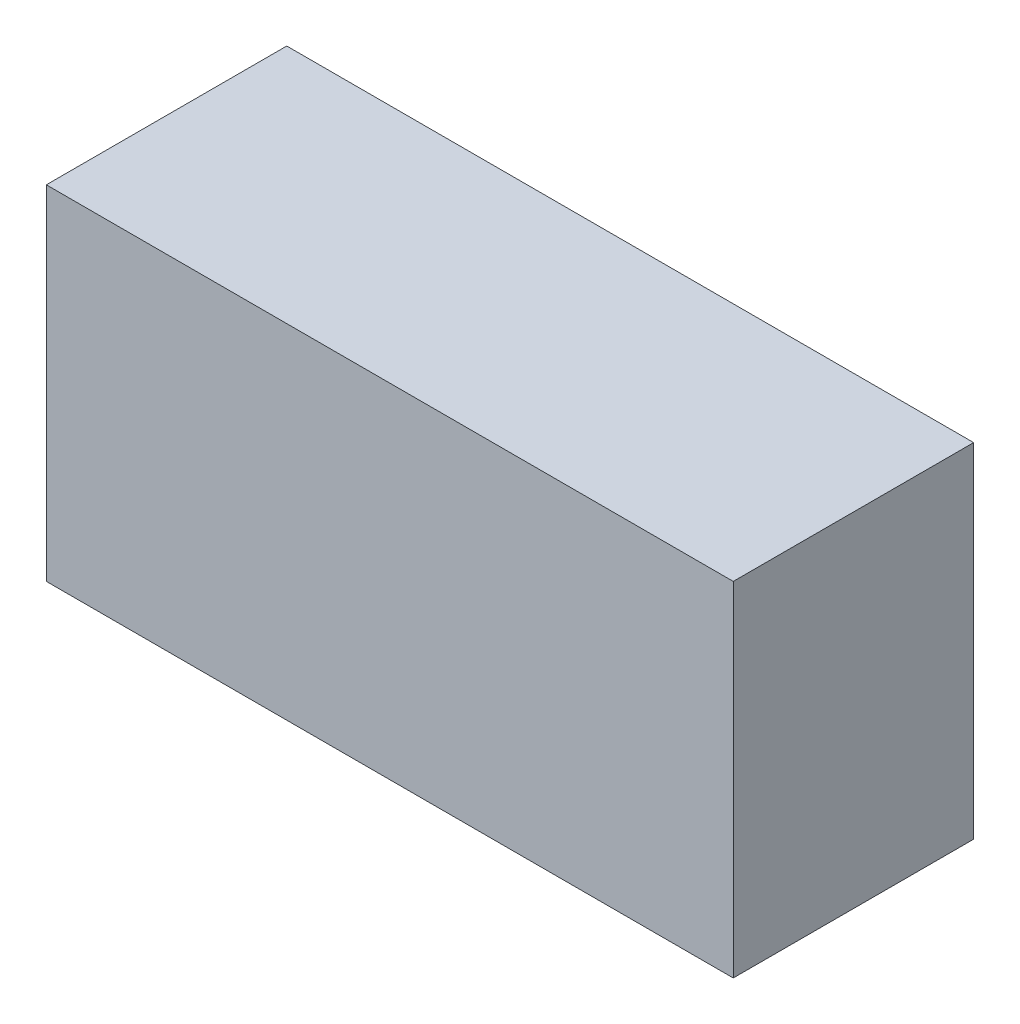
ISO-10303-21;
HEADER;
FILE_DESCRIPTION(('STEP AP214'),'2;1');
FILE_NAME('part.step','',(''),(''),'','','');
FILE_SCHEMA(('AUTOMOTIVE_DESIGN { 1 0 10303 214 1 1 1 1 }'));
ENDSEC;
DATA;
#1=APPLICATION_CONTEXT('core data for automotive mechanical design processes');
#2=APPLICATION_PROTOCOL_DEFINITION('international standard','automotive_design',2000,#1);
#3=PRODUCT_CONTEXT('',#1,'mechanical');
#4=PRODUCT('Part','Part','',(#3));
#5=PRODUCT_RELATED_PRODUCT_CATEGORY('part','',(#4));
#6=PRODUCT_DEFINITION_FORMATION('','',#4);
#7=PRODUCT_DEFINITION_CONTEXT('part definition',#1,'design');
#8=PRODUCT_DEFINITION('design','',#6,#7);
#9=PRODUCT_DEFINITION_SHAPE('','',#8);
#10=(LENGTH_UNIT() NAMED_UNIT(*) SI_UNIT(.MILLI.,.METRE.));
#11=(NAMED_UNIT(*) PLANE_ANGLE_UNIT() SI_UNIT($,.RADIAN.));
#12=(NAMED_UNIT(*) SI_UNIT($,.STERADIAN.) SOLID_ANGLE_UNIT());
#13=UNCERTAINTY_MEASURE_WITH_UNIT(LENGTH_MEASURE(1.E-05),#10,'distance_accuracy_value','');
#14=(GEOMETRIC_REPRESENTATION_CONTEXT(3) GLOBAL_UNCERTAINTY_ASSIGNED_CONTEXT((#13)) GLOBAL_UNIT_ASSIGNED_CONTEXT((#10,
#11,#12)) REPRESENTATION_CONTEXT('',''));
#15=CARTESIAN_POINT('',(0.,0.,0.));
#16=DIRECTION('',(0.,0.,1.));
#17=DIRECTION('',(1.,0.,0.));
#18=AXIS2_PLACEMENT_3D('',#15,#16,#17);
#19=CARTESIAN_POINT('',(100.,50.,70.));
#20=DIRECTION('',(-1.,0.,0.));
#21=DIRECTION('',(0.,0.,1.));
#22=AXIS2_PLACEMENT_3D('',#19,#20,#21);
#23=PLANE('',#22);
#24=DIRECTION('',(0.,1.,0.));
#25=VECTOR('',#24,1.);
#26=CARTESIAN_POINT('',(100.,50.,0.));
#27=LINE('',#26,#25);
#28=CARTESIAN_POINT('',(100.,-50.,0.));
#29=VERTEX_POINT('',#28);
#30=CARTESIAN_POINT('',(100.,50.,0.));
#31=VERTEX_POINT('',#30);
#32=EDGE_CURVE('E105',#29,#31,#27,.T.);
#33=ORIENTED_EDGE('',*,*,#32,.T.);
#34=DIRECTION('',(0.,0.,-1.));
#35=VECTOR('',#34,1.);
#36=CARTESIAN_POINT('',(100.,50.,70.));
#37=LINE('',#36,#35);
#38=CARTESIAN_POINT('',(100.,50.,70.));
#39=VERTEX_POINT('',#38);
#40=EDGE_CURVE('E42',#39,#31,#37,.T.);
#41=ORIENTED_EDGE('',*,*,#40,.F.);
#42=DIRECTION('',(0.,1.,0.));
#43=VECTOR('',#42,1.);
#44=CARTESIAN_POINT('',(100.,50.,70.));
#45=LINE('',#44,#43);
#46=CARTESIAN_POINT('',(100.,-50.,70.));
#47=VERTEX_POINT('',#46);
#48=EDGE_CURVE('E92',#47,#39,#45,.T.);
#49=ORIENTED_EDGE('',*,*,#48,.F.);
#50=DIRECTION('',(0.,0.,-1.));
#51=VECTOR('',#50,1.);
#52=CARTESIAN_POINT('',(100.,-50.,70.));
#53=LINE('',#52,#51);
#54=EDGE_CURVE('E101',#47,#29,#53,.T.);
#55=ORIENTED_EDGE('',*,*,#54,.T.);
#56=EDGE_LOOP('',(#33,#41,#49,#55));
#57=FACE_BOUND('',#56,.T.);
#58=ADVANCED_FACE('F39',(#57),#23,.F.);
#59=CARTESIAN_POINT('',(-100.,50.,70.));
#60=DIRECTION('',(0.,-1.,0.));
#61=DIRECTION('',(0.,0.,-1.));
#62=AXIS2_PLACEMENT_3D('',#59,#60,#61);
#63=PLANE('',#62);
#64=DIRECTION('',(-1.,0.,0.));
#65=VECTOR('',#64,1.);
#66=CARTESIAN_POINT('',(-100.,50.,0.));
#67=LINE('',#66,#65);
#68=CARTESIAN_POINT('',(-100.,50.,0.));
#69=VERTEX_POINT('',#68);
#70=EDGE_CURVE('E97',#31,#69,#67,.T.);
#71=ORIENTED_EDGE('',*,*,#70,.T.);
#72=DIRECTION('',(0.,0.,-1.));
#73=VECTOR('',#72,1.);
#74=CARTESIAN_POINT('',(-100.,50.,70.));
#75=LINE('',#74,#73);
#76=CARTESIAN_POINT('',(-100.,50.,70.));
#77=VERTEX_POINT('',#76);
#78=EDGE_CURVE('E95',#77,#69,#75,.T.);
#79=ORIENTED_EDGE('',*,*,#78,.F.);
#80=DIRECTION('',(-1.,0.,0.));
#81=VECTOR('',#80,1.);
#82=CARTESIAN_POINT('',(-100.,50.,70.));
#83=LINE('',#82,#81);
#84=EDGE_CURVE('E87',#39,#77,#83,.T.);
#85=ORIENTED_EDGE('',*,*,#84,.F.);
#86=ORIENTED_EDGE('',*,*,#40,.T.);
#87=EDGE_LOOP('',(#71,#79,#85,#86));
#88=FACE_BOUND('',#87,.T.);
#89=ADVANCED_FACE('F96',(#88),#63,.F.);
#90=CARTESIAN_POINT('',(-100.,50.,70.));
#91=DIRECTION('',(1.,0.,0.));
#92=DIRECTION('',(0.,0.,-1.));
#93=AXIS2_PLACEMENT_3D('',#90,#91,#92);
#94=PLANE('',#93);
#95=DIRECTION('',(0.,-1.,0.));
#96=VECTOR('',#95,1.);
#97=CARTESIAN_POINT('',(-100.,50.,0.));
#98=LINE('',#97,#96);
#99=CARTESIAN_POINT('',(-100.,-50.,0.));
#100=VERTEX_POINT('',#99);
#101=EDGE_CURVE('E73',#69,#100,#98,.T.);
#102=ORIENTED_EDGE('',*,*,#101,.T.);
#103=DIRECTION('',(0.,0.,-1.));
#104=VECTOR('',#103,1.);
#105=CARTESIAN_POINT('',(-100.,-50.,70.));
#106=LINE('',#105,#104);
#107=CARTESIAN_POINT('',(-100.,-50.,70.));
#108=VERTEX_POINT('',#107);
#109=EDGE_CURVE('E98',#108,#100,#106,.T.);
#110=ORIENTED_EDGE('',*,*,#109,.F.);
#111=DIRECTION('',(0.,-1.,0.));
#112=VECTOR('',#111,1.);
#113=CARTESIAN_POINT('',(-100.,50.,70.));
#114=LINE('',#113,#112);
#115=EDGE_CURVE('E90',#77,#108,#114,.T.);
#116=ORIENTED_EDGE('',*,*,#115,.F.);
#117=ORIENTED_EDGE('',*,*,#78,.T.);
#118=EDGE_LOOP('',(#102,#110,#116,#117));
#119=FACE_BOUND('',#118,.T.);
#120=ADVANCED_FACE('F99',(#119),#94,.F.);
#121=CARTESIAN_POINT('',(-100.,-50.,70.));
#122=DIRECTION('',(0.,1.,0.));
#123=DIRECTION('',(0.,0.,1.));
#124=AXIS2_PLACEMENT_3D('',#121,#122,#123);
#125=PLANE('',#124);
#126=DIRECTION('',(1.,0.,0.));
#127=VECTOR('',#126,1.);
#128=CARTESIAN_POINT('',(-100.,-50.,0.));
#129=LINE('',#128,#127);
#130=EDGE_CURVE('E79',#100,#29,#129,.T.);
#131=ORIENTED_EDGE('',*,*,#130,.T.);
#132=ORIENTED_EDGE('',*,*,#54,.F.);
#133=DIRECTION('',(1.,0.,0.));
#134=VECTOR('',#133,1.);
#135=CARTESIAN_POINT('',(-100.,-50.,70.));
#136=LINE('',#135,#134);
#137=EDGE_CURVE('E56',#108,#47,#136,.T.);
#138=ORIENTED_EDGE('',*,*,#137,.F.);
#139=ORIENTED_EDGE('',*,*,#109,.T.);
#140=EDGE_LOOP('',(#131,#132,#138,#139));
#141=FACE_BOUND('',#140,.T.);
#142=ADVANCED_FACE('F113',(#141),#125,.F.);
#143=CARTESIAN_POINT('',(0.,0.,70.));
#144=DIRECTION('',(0.,0.,1.));
#145=DIRECTION('',(1.,0.,0.));
#146=AXIS2_PLACEMENT_3D('',#143,#144,#145);
#147=PLANE('',#146);
#148=ORIENTED_EDGE('',*,*,#48,.T.);
#149=ORIENTED_EDGE('',*,*,#84,.T.);
#150=ORIENTED_EDGE('',*,*,#115,.T.);
#151=ORIENTED_EDGE('',*,*,#137,.T.);
#152=EDGE_LOOP('',(#148,#149,#150,#151));
#153=FACE_BOUND('',#152,.T.);
#154=ADVANCED_FACE('F88',(#153),#147,.T.);
#155=CARTESIAN_POINT('',(0.,0.,0.));
#156=DIRECTION('',(0.,0.,1.));
#157=DIRECTION('',(1.,0.,0.));
#158=AXIS2_PLACEMENT_3D('',#155,#156,#157);
#159=PLANE('',#158);
#160=CARTESIAN_POINT('',(0.,0.,0.));
#161=DIRECTION('',(0.,0.,-1.));
#162=DIRECTION('',(-1.,0.,0.));
#163=AXIS2_PLACEMENT_3D('',#160,#161,#162);
#164=CIRCLE('',#163,25.);
#165=CARTESIAN_POINT('',(-25.,0.,0.));
#166=VERTEX_POINT('',#165);
#167=EDGE_CURVE('E11',#166,#166,#164,.T.);
#168=ORIENTED_EDGE('',*,*,#167,.F.);
#169=EDGE_LOOP('',(#168));
#170=FACE_BOUND('',#169,.T.);
#171=ORIENTED_EDGE('',*,*,#32,.F.);
#172=ORIENTED_EDGE('',*,*,#130,.F.);
#173=ORIENTED_EDGE('',*,*,#101,.F.);
#174=ORIENTED_EDGE('',*,*,#70,.F.);
#175=EDGE_LOOP('',(#171,#172,#173,#174));
#176=FACE_BOUND('',#175,.T.);
#177=ADVANCED_FACE('F116',(#170,#176),#159,.F.);
#178=CARTESIAN_POINT('',(0.,0.,-20.));
#179=DIRECTION('',(0.,0.,1.));
#180=DIRECTION('',(1.,0.,0.));
#181=AXIS2_PLACEMENT_3D('',#178,#179,#180);
#182=CYLINDRICAL_SURFACE('',#181,25.);
#183=CARTESIAN_POINT('',(0.,0.,-20.));
#184=DIRECTION('',(0.,0.,-1.));
#185=DIRECTION('',(-1.,0.,0.));
#186=AXIS2_PLACEMENT_3D('',#183,#184,#185);
#187=CIRCLE('',#186,25.);
#188=CARTESIAN_POINT('',(-25.,0.,-20.));
#189=VERTEX_POINT('',#188);
#190=EDGE_CURVE('E108',#189,#189,#187,.T.);
#191=ORIENTED_EDGE('',*,*,#190,.F.);
#192=EDGE_LOOP('',(#191));
#193=FACE_BOUND('',#192,.T.);
#194=ORIENTED_EDGE('',*,*,#167,.T.);
#195=EDGE_LOOP('',(#194));
#196=FACE_BOUND('',#195,.T.);
#197=ADVANCED_FACE('F124',(#193,#196),#182,.T.);
#198=CARTESIAN_POINT('',(0.,0.,-20.));
#199=DIRECTION('',(0.,0.,-1.));
#200=DIRECTION('',(-1.,0.,0.));
#201=AXIS2_PLACEMENT_3D('',#198,#199,#200);
#202=PLANE('',#201);
#203=ORIENTED_EDGE('',*,*,#190,.T.);
#204=EDGE_LOOP('',(#203));
#205=FACE_BOUND('',#204,.T.);
#206=ADVANCED_FACE('F122',(#205),#202,.T.);
#207=CLOSED_SHELL('',(#58,#89,#120,#142,#154,#177,#197,#206));
#208=MANIFOLD_SOLID_BREP('B2',#207);
#209=ADVANCED_BREP_SHAPE_REPRESENTATION('',(#18,#208),#14);
#210=SHAPE_DEFINITION_REPRESENTATION(#9,#209);
ENDSEC;
END-ISO-10303-21;
